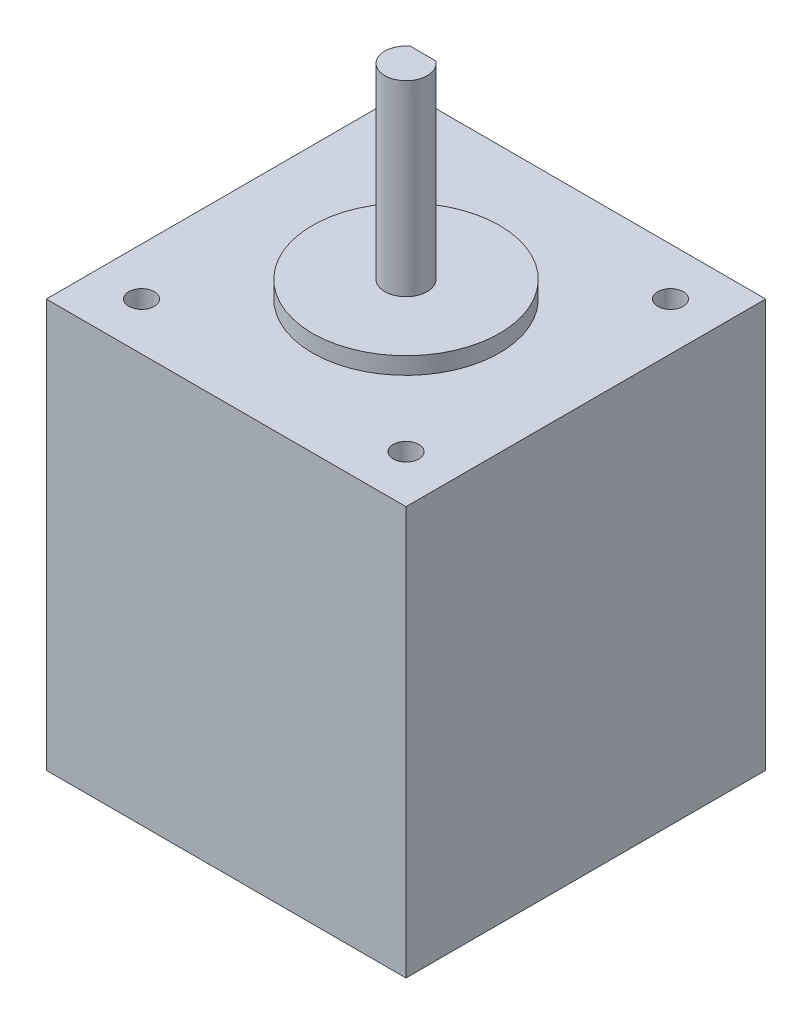
ISO-10303-21;
HEADER;
FILE_DESCRIPTION(('STEP AP214'),'2;1');
FILE_NAME('part.step','',(''),(''),'','','');
FILE_SCHEMA(('AUTOMOTIVE_DESIGN { 1 0 10303 214 1 1 1 1 }'));
ENDSEC;
DATA;
#1=APPLICATION_CONTEXT('core data for automotive mechanical design processes');
#2=APPLICATION_PROTOCOL_DEFINITION('international standard','automotive_design',2000,#1);
#3=PRODUCT_CONTEXT('',#1,'mechanical');
#4=PRODUCT('Part','Part','',(#3));
#5=PRODUCT_RELATED_PRODUCT_CATEGORY('part','',(#4));
#6=PRODUCT_DEFINITION_FORMATION('','',#4);
#7=PRODUCT_DEFINITION_CONTEXT('part definition',#1,'design');
#8=PRODUCT_DEFINITION('design','',#6,#7);
#9=PRODUCT_DEFINITION_SHAPE('','',#8);
#10=(LENGTH_UNIT() NAMED_UNIT(*) SI_UNIT(.MILLI.,.METRE.));
#11=(NAMED_UNIT(*) PLANE_ANGLE_UNIT() SI_UNIT($,.RADIAN.));
#12=(NAMED_UNIT(*) SI_UNIT($,.STERADIAN.) SOLID_ANGLE_UNIT());
#13=UNCERTAINTY_MEASURE_WITH_UNIT(LENGTH_MEASURE(1.E-05),#10,'distance_accuracy_value','');
#14=(GEOMETRIC_REPRESENTATION_CONTEXT(3) GLOBAL_UNCERTAINTY_ASSIGNED_CONTEXT((#13)) GLOBAL_UNIT_ASSIGNED_CONTEXT((#10,
#11,#12)) REPRESENTATION_CONTEXT('',''));
#15=CARTESIAN_POINT('',(0.,0.,0.));
#16=DIRECTION('',(0.,0.,1.));
#17=DIRECTION('',(1.,0.,0.));
#18=AXIS2_PLACEMENT_3D('',#15,#16,#17);
#19=CARTESIAN_POINT('',(21.15,-23.,64.6));
#20=DIRECTION('',(-1.,0.,0.));
#21=DIRECTION('',(0.,0.,1.));
#22=AXIS2_PLACEMENT_3D('',#19,#20,#21);
#23=PLANE('',#22);
#24=DIRECTION('',(0.,0.,1.));
#25=VECTOR('',#24,1.);
#26=CARTESIAN_POINT('',(21.15,25.,64.6));
#27=LINE('',#26,#25);
#28=CARTESIAN_POINT('',(21.15,25.,22.3));
#29=VERTEX_POINT('',#28);
#30=CARTESIAN_POINT('',(21.15,25.,64.6));
#31=VERTEX_POINT('',#30);
#32=EDGE_CURVE('E118',#29,#31,#27,.T.);
#33=ORIENTED_EDGE('',*,*,#32,.T.);
#34=DIRECTION('',(0.,1.,0.));
#35=VECTOR('',#34,1.);
#36=CARTESIAN_POINT('',(21.15,-23.,64.6));
#37=LINE('',#36,#35);
#38=CARTESIAN_POINT('',(21.15,-23.,64.6));
#39=VERTEX_POINT('',#38);
#40=EDGE_CURVE('E127',#39,#31,#37,.T.);
#41=ORIENTED_EDGE('',*,*,#40,.F.);
#42=DIRECTION('',(0.,0.,1.));
#43=VECTOR('',#42,1.);
#44=CARTESIAN_POINT('',(21.15,-23.,64.6));
#45=LINE('',#44,#43);
#46=CARTESIAN_POINT('',(21.15,-23.,22.3));
#47=VERTEX_POINT('',#46);
#48=EDGE_CURVE('E128',#47,#39,#45,.T.);
#49=ORIENTED_EDGE('',*,*,#48,.F.);
#50=DIRECTION('',(0.,1.,0.));
#51=VECTOR('',#50,1.);
#52=CARTESIAN_POINT('',(21.15,-23.,22.3));
#53=LINE('',#52,#51);
#54=EDGE_CURVE('E134',#47,#29,#53,.T.);
#55=ORIENTED_EDGE('',*,*,#54,.T.);
#56=EDGE_LOOP('',(#33,#41,#49,#55));
#57=FACE_BOUND('',#56,.T.);
#58=ADVANCED_FACE('F40',(#57),#23,.F.);
#59=CARTESIAN_POINT('',(-21.15,-23.,64.6));
#60=DIRECTION('',(0.,0.,-1.));
#61=DIRECTION('',(-1.,0.,0.));
#62=AXIS2_PLACEMENT_3D('',#59,#60,#61);
#63=PLANE('',#62);
#64=DIRECTION('',(-1.,0.,0.));
#65=VECTOR('',#64,1.);
#66=CARTESIAN_POINT('',(-21.15,25.,64.6));
#67=LINE('',#66,#65);
#68=CARTESIAN_POINT('',(-21.15,25.,64.6));
#69=VERTEX_POINT('',#68);
#70=EDGE_CURVE('E137',#31,#69,#67,.T.);
#71=ORIENTED_EDGE('',*,*,#70,.T.);
#72=DIRECTION('',(0.,1.,0.));
#73=VECTOR('',#72,1.);
#74=CARTESIAN_POINT('',(-21.15,-23.,64.6));
#75=LINE('',#74,#73);
#76=CARTESIAN_POINT('',(-21.15,-23.,64.6));
#77=VERTEX_POINT('',#76);
#78=EDGE_CURVE('E145',#77,#69,#75,.T.);
#79=ORIENTED_EDGE('',*,*,#78,.F.);
#80=DIRECTION('',(-1.,0.,0.));
#81=VECTOR('',#80,1.);
#82=CARTESIAN_POINT('',(-21.15,-23.,64.6));
#83=LINE('',#82,#81);
#84=EDGE_CURVE('E92',#39,#77,#83,.T.);
#85=ORIENTED_EDGE('',*,*,#84,.F.);
#86=ORIENTED_EDGE('',*,*,#40,.T.);
#87=EDGE_LOOP('',(#71,#79,#85,#86));
#88=FACE_BOUND('',#87,.T.);
#89=ADVANCED_FACE('F149',(#88),#63,.F.);
#90=CARTESIAN_POINT('',(-21.15,-23.,64.6));
#91=DIRECTION('',(1.,0.,0.));
#92=DIRECTION('',(0.,0.,-1.));
#93=AXIS2_PLACEMENT_3D('',#90,#91,#92);
#94=PLANE('',#93);
#95=DIRECTION('',(0.,0.,-1.));
#96=VECTOR('',#95,1.);
#97=CARTESIAN_POINT('',(-21.15,25.,64.6));
#98=LINE('',#97,#96);
#99=CARTESIAN_POINT('',(-21.15,25.,22.3));
#100=VERTEX_POINT('',#99);
#101=EDGE_CURVE('E139',#69,#100,#98,.T.);
#102=ORIENTED_EDGE('',*,*,#101,.T.);
#103=DIRECTION('',(0.,1.,0.));
#104=VECTOR('',#103,1.);
#105=CARTESIAN_POINT('',(-21.15,-23.,22.3));
#106=LINE('',#105,#104);
#107=CARTESIAN_POINT('',(-21.15,-23.,22.3));
#108=VERTEX_POINT('',#107);
#109=EDGE_CURVE('E143',#108,#100,#106,.T.);
#110=ORIENTED_EDGE('',*,*,#109,.F.);
#111=DIRECTION('',(0.,0.,-1.));
#112=VECTOR('',#111,1.);
#113=CARTESIAN_POINT('',(-21.15,-23.,64.6));
#114=LINE('',#113,#112);
#115=EDGE_CURVE('E131',#77,#108,#114,.T.);
#116=ORIENTED_EDGE('',*,*,#115,.F.);
#117=ORIENTED_EDGE('',*,*,#78,.T.);
#118=EDGE_LOOP('',(#102,#110,#116,#117));
#119=FACE_BOUND('',#118,.T.);
#120=ADVANCED_FACE('F158',(#119),#94,.F.);
#121=CARTESIAN_POINT('',(-21.15,-23.,22.3));
#122=DIRECTION('',(0.,0.,1.));
#123=DIRECTION('',(1.,0.,0.));
#124=AXIS2_PLACEMENT_3D('',#121,#122,#123);
#125=PLANE('',#124);
#126=DIRECTION('',(1.,0.,0.));
#127=VECTOR('',#126,1.);
#128=CARTESIAN_POINT('',(-21.15,25.,22.3));
#129=LINE('',#128,#127);
#130=EDGE_CURVE('E84',#100,#29,#129,.T.);
#131=ORIENTED_EDGE('',*,*,#130,.T.);
#132=ORIENTED_EDGE('',*,*,#54,.F.);
#133=DIRECTION('',(1.,0.,0.));
#134=VECTOR('',#133,1.);
#135=CARTESIAN_POINT('',(-21.15,-23.,22.3));
#136=LINE('',#135,#134);
#137=EDGE_CURVE('E63',#108,#47,#136,.T.);
#138=ORIENTED_EDGE('',*,*,#137,.F.);
#139=ORIENTED_EDGE('',*,*,#109,.T.);
#140=EDGE_LOOP('',(#131,#132,#138,#139));
#141=FACE_BOUND('',#140,.T.);
#142=ADVANCED_FACE('F160',(#141),#125,.F.);
#143=CARTESIAN_POINT('',(0.,-23.,0.));
#144=DIRECTION('',(0.,-1.,0.));
#145=DIRECTION('',(0.,0.,-1.));
#146=AXIS2_PLACEMENT_3D('',#143,#144,#145);
#147=PLANE('',#146);
#148=ORIENTED_EDGE('',*,*,#48,.T.);
#149=ORIENTED_EDGE('',*,*,#84,.T.);
#150=ORIENTED_EDGE('',*,*,#115,.T.);
#151=ORIENTED_EDGE('',*,*,#137,.T.);
#152=EDGE_LOOP('',(#148,#149,#150,#151));
#153=FACE_BOUND('',#152,.T.);
#154=ADVANCED_FACE('F161',(#153),#147,.T.);
#155=CARTESIAN_POINT('',(0.,25.,0.));
#156=DIRECTION('',(0.,-1.,0.));
#157=DIRECTION('',(0.,0.,-1.));
#158=AXIS2_PLACEMENT_3D('',#155,#156,#157);
#159=PLANE('',#158);
#160=CARTESIAN_POINT('',(15.55,25.,27.9));
#161=DIRECTION('',(0.,-1.,0.));
#162=DIRECTION('',(0.,0.,1.));
#163=AXIS2_PLACEMENT_3D('',#160,#161,#162);
#164=CIRCLE('',#163,1.5);
#165=CARTESIAN_POINT('',(15.55,25.,29.4));
#166=VERTEX_POINT('',#165);
#167=EDGE_CURVE('E387',#166,#166,#164,.T.);
#168=ORIENTED_EDGE('',*,*,#167,.T.);
#169=EDGE_LOOP('',(#168));
#170=FACE_BOUND('',#169,.T.);
#171=CARTESIAN_POINT('',(15.55,25.,59.));
#172=DIRECTION('',(0.,-1.,0.));
#173=DIRECTION('',(0.,0.,1.));
#174=AXIS2_PLACEMENT_3D('',#171,#172,#173);
#175=CIRCLE('',#174,1.5);
#176=CARTESIAN_POINT('',(15.55,25.,60.5));
#177=VERTEX_POINT('',#176);
#178=EDGE_CURVE('E398',#177,#177,#175,.T.);
#179=ORIENTED_EDGE('',*,*,#178,.T.);
#180=EDGE_LOOP('',(#179));
#181=FACE_BOUND('',#180,.T.);
#182=CARTESIAN_POINT('',(-15.55,25.,27.9));
#183=DIRECTION('',(0.,1.,0.));
#184=DIRECTION('',(0.,0.,1.));
#185=AXIS2_PLACEMENT_3D('',#182,#183,#184);
#186=CIRCLE('',#185,1.5);
#187=CARTESIAN_POINT('',(-15.55,25.,29.4));
#188=VERTEX_POINT('',#187);
#189=EDGE_CURVE('E404',#188,#188,#186,.T.);
#190=ORIENTED_EDGE('',*,*,#189,.F.);
#191=EDGE_LOOP('',(#190));
#192=FACE_BOUND('',#191,.T.);
#193=CARTESIAN_POINT('',(-15.55,25.,59.));
#194=DIRECTION('',(0.,1.,0.));
#195=DIRECTION('',(0.,0.,1.));
#196=AXIS2_PLACEMENT_3D('',#193,#194,#195);
#197=CIRCLE('',#196,1.5);
#198=CARTESIAN_POINT('',(-15.55,25.,60.5));
#199=VERTEX_POINT('',#198);
#200=EDGE_CURVE('E390',#199,#199,#197,.T.);
#201=ORIENTED_EDGE('',*,*,#200,.F.);
#202=EDGE_LOOP('',(#201));
#203=FACE_BOUND('',#202,.T.);
#204=CARTESIAN_POINT('',(0.,25.,43.45));
#205=DIRECTION('',(0.,1.,0.));
#206=DIRECTION('',(0.,0.,1.));
#207=AXIS2_PLACEMENT_3D('',#204,#205,#206);
#208=CIRCLE('',#207,11.);
#209=CARTESIAN_POINT('',(0.,25.,54.45));
#210=VERTEX_POINT('',#209);
#211=EDGE_CURVE('E123',#210,#210,#208,.T.);
#212=ORIENTED_EDGE('',*,*,#211,.F.);
#213=EDGE_LOOP('',(#212));
#214=FACE_BOUND('',#213,.T.);
#215=ORIENTED_EDGE('',*,*,#32,.F.);
#216=ORIENTED_EDGE('',*,*,#130,.F.);
#217=ORIENTED_EDGE('',*,*,#101,.F.);
#218=ORIENTED_EDGE('',*,*,#70,.F.);
#219=EDGE_LOOP('',(#215,#216,#217,#218));
#220=FACE_BOUND('',#219,.T.);
#221=ADVANCED_FACE('F154',(#170,#181,#192,#203,#214,#220),#159,.F.);
#222=CARTESIAN_POINT('',(0.,27.,43.45));
#223=DIRECTION('',(0.,-1.,0.));
#224=DIRECTION('',(0.,0.,-1.));
#225=AXIS2_PLACEMENT_3D('',#222,#223,#224);
#226=CYLINDRICAL_SURFACE('',#225,11.);
#227=CARTESIAN_POINT('',(0.,27.,43.45));
#228=DIRECTION('',(0.,1.,0.));
#229=DIRECTION('',(0.,0.,1.));
#230=AXIS2_PLACEMENT_3D('',#227,#228,#229);
#231=CIRCLE('',#230,11.);
#232=CARTESIAN_POINT('',(0.,27.,54.45));
#233=VERTEX_POINT('',#232);
#234=EDGE_CURVE('E115',#233,#233,#231,.T.);
#235=ORIENTED_EDGE('',*,*,#234,.F.);
#236=EDGE_LOOP('',(#235));
#237=FACE_BOUND('',#236,.T.);
#238=ORIENTED_EDGE('',*,*,#211,.T.);
#239=EDGE_LOOP('',(#238));
#240=FACE_BOUND('',#239,.T.);
#241=ADVANCED_FACE('F168',(#237,#240),#226,.T.);
#242=CARTESIAN_POINT('',(0.,27.,43.45));
#243=DIRECTION('',(0.,1.,0.));
#244=DIRECTION('',(0.,0.,1.));
#245=AXIS2_PLACEMENT_3D('',#242,#243,#244);
#246=PLANE('',#245);
#247=CARTESIAN_POINT('',(0.,27.,43.45));
#248=DIRECTION('',(0.,1.,0.));
#249=DIRECTION('',(0.,0.,1.));
#250=AXIS2_PLACEMENT_3D('',#247,#248,#249);
#251=CIRCLE('',#250,2.5);
#252=CARTESIAN_POINT('',(0.,27.,45.95));
#253=VERTEX_POINT('',#252);
#254=EDGE_CURVE('E107',#253,#253,#251,.T.);
#255=ORIENTED_EDGE('',*,*,#254,.F.);
#256=EDGE_LOOP('',(#255));
#257=FACE_BOUND('',#256,.T.);
#258=ORIENTED_EDGE('',*,*,#234,.T.);
#259=EDGE_LOOP('',(#258));
#260=FACE_BOUND('',#259,.T.);
#261=ADVANCED_FACE('F203',(#257,#260),#246,.T.);
#262=CARTESIAN_POINT('',(0.,49.,43.45));
#263=DIRECTION('',(0.,-1.,0.));
#264=DIRECTION('',(0.,0.,-1.));
#265=AXIS2_PLACEMENT_3D('',#262,#263,#264);
#266=CYLINDRICAL_SURFACE('',#265,2.5);
#267=CARTESIAN_POINT('',(0.,49.,43.45));
#268=DIRECTION('',(0.,1.,0.));
#269=DIRECTION('',(0.,0.,1.));
#270=AXIS2_PLACEMENT_3D('',#267,#268,#269);
#271=CIRCLE('',#270,2.5);
#272=CARTESIAN_POINT('',(-1.5,49.,41.45));
#273=VERTEX_POINT('',#272);
#274=CARTESIAN_POINT('',(1.5,49.,41.45));
#275=VERTEX_POINT('',#274);
#276=EDGE_CURVE('E111',#273,#275,#271,.T.);
#277=ORIENTED_EDGE('',*,*,#276,.F.);
#278=DIRECTION('',(0.,-1.,0.));
#279=VECTOR('',#278,1.);
#280=CARTESIAN_POINT('',(-1.5,49.,41.45));
#281=LINE('',#280,#279);
#282=CARTESIAN_POINT('',(-1.5,34.,41.45));
#283=VERTEX_POINT('',#282);
#284=EDGE_CURVE('E54',#273,#283,#281,.T.);
#285=ORIENTED_EDGE('',*,*,#284,.T.);
#286=CARTESIAN_POINT('',(0.,34.,43.45));
#287=DIRECTION('',(0.,1.,0.));
#288=DIRECTION('',(0.,0.,1.));
#289=AXIS2_PLACEMENT_3D('',#286,#287,#288);
#290=CIRCLE('',#289,2.5);
#291=CARTESIAN_POINT('',(1.5,34.,41.45));
#292=VERTEX_POINT('',#291);
#293=EDGE_CURVE('E11',#292,#283,#290,.T.);
#294=ORIENTED_EDGE('',*,*,#293,.F.);
#295=DIRECTION('',(0.,-1.,0.));
#296=VECTOR('',#295,1.);
#297=CARTESIAN_POINT('',(1.5,49.,41.45));
#298=LINE('',#297,#296);
#299=EDGE_CURVE('E102',#292,#275,#298,.F.);
#300=ORIENTED_EDGE('',*,*,#299,.T.);
#301=EDGE_LOOP('',(#277,#285,#294,#300));
#302=FACE_BOUND('',#301,.T.);
#303=ORIENTED_EDGE('',*,*,#254,.T.);
#304=EDGE_LOOP('',(#303));
#305=FACE_BOUND('',#304,.T.);
#306=ADVANCED_FACE('F109',(#302,#305),#266,.T.);
#307=CARTESIAN_POINT('',(0.,49.,43.45));
#308=DIRECTION('',(0.,1.,0.));
#309=DIRECTION('',(0.,0.,1.));
#310=AXIS2_PLACEMENT_3D('',#307,#308,#309);
#311=PLANE('',#310);
#312=DIRECTION('',(1.,0.,0.));
#313=VECTOR('',#312,1.);
#314=CARTESIAN_POINT('',(0.,49.,41.45));
#315=LINE('',#314,#313);
#316=EDGE_CURVE('E47',#273,#275,#315,.T.);
#317=ORIENTED_EDGE('',*,*,#316,.F.);
#318=ORIENTED_EDGE('',*,*,#276,.T.);
#319=EDGE_LOOP('',(#317,#318));
#320=FACE_BOUND('',#319,.T.);
#321=ADVANCED_FACE('F114',(#320),#311,.T.);
#322=CARTESIAN_POINT('',(0.,34.,0.));
#323=DIRECTION('',(0.,1.,0.));
#324=DIRECTION('',(0.,0.,1.));
#325=AXIS2_PLACEMENT_3D('',#322,#323,#324);
#326=PLANE('',#325);
#327=DIRECTION('',(1.,0.,0.));
#328=VECTOR('',#327,1.);
#329=CARTESIAN_POINT('',(-2.5,34.,41.45));
#330=LINE('',#329,#328);
#331=EDGE_CURVE('E112',#283,#292,#330,.T.);
#332=ORIENTED_EDGE('',*,*,#331,.T.);
#333=ORIENTED_EDGE('',*,*,#293,.T.);
#334=EDGE_LOOP('',(#332,#333));
#335=FACE_BOUND('',#334,.T.);
#336=ADVANCED_FACE('F232',(#335),#326,.T.);
#337=CARTESIAN_POINT('',(-2.5,34.,41.45));
#338=DIRECTION('',(0.,0.,1.));
#339=DIRECTION('',(1.,0.,0.));
#340=AXIS2_PLACEMENT_3D('',#337,#338,#339);
#341=PLANE('',#340);
#342=ORIENTED_EDGE('',*,*,#316,.T.);
#343=ORIENTED_EDGE('',*,*,#299,.F.);
#344=ORIENTED_EDGE('',*,*,#331,.F.);
#345=ORIENTED_EDGE('',*,*,#284,.F.);
#346=EDGE_LOOP('',(#342,#343,#344,#345));
#347=FACE_BOUND('',#346,.T.);
#348=ADVANCED_FACE('F101',(#347),#341,.F.);
#349=CARTESIAN_POINT('',(-15.55,20.5,59.));
#350=DIRECTION('',(0.,1.,0.));
#351=DIRECTION('',(0.,0.,1.));
#352=AXIS2_PLACEMENT_3D('',#349,#350,#351);
#353=CYLINDRICAL_SURFACE('',#352,1.5);
#354=CARTESIAN_POINT('',(-15.55,20.5,59.));
#355=DIRECTION('',(0.,1.,0.));
#356=DIRECTION('',(0.,0.,1.));
#357=AXIS2_PLACEMENT_3D('',#354,#355,#356);
#358=CIRCLE('',#357,1.5);
#359=CARTESIAN_POINT('',(-15.55,20.5,60.5));
#360=VERTEX_POINT('',#359);
#361=EDGE_CURVE('E386',#360,#360,#358,.T.);
#362=ORIENTED_EDGE('',*,*,#361,.F.);
#363=EDGE_LOOP('',(#362));
#364=FACE_BOUND('',#363,.T.);
#365=ORIENTED_EDGE('',*,*,#200,.T.);
#366=EDGE_LOOP('',(#365));
#367=FACE_BOUND('',#366,.T.);
#368=ADVANCED_FACE('F252',(#364,#367),#353,.F.);
#369=CARTESIAN_POINT('',(-15.55,20.5,59.));
#370=DIRECTION('',(0.,1.,0.));
#371=DIRECTION('',(0.,0.,1.));
#372=AXIS2_PLACEMENT_3D('',#369,#370,#371);
#373=PLANE('',#372);
#374=ORIENTED_EDGE('',*,*,#361,.T.);
#375=EDGE_LOOP('',(#374));
#376=FACE_BOUND('',#375,.T.);
#377=ADVANCED_FACE('F262',(#376),#373,.T.);
#378=CARTESIAN_POINT('',(-15.55,20.5,27.9));
#379=DIRECTION('',(0.,1.,0.));
#380=DIRECTION('',(0.,0.,1.));
#381=AXIS2_PLACEMENT_3D('',#378,#379,#380);
#382=CYLINDRICAL_SURFACE('',#381,1.5);
#383=CARTESIAN_POINT('',(-15.55,20.5,27.9));
#384=DIRECTION('',(0.,1.,0.));
#385=DIRECTION('',(0.,0.,1.));
#386=AXIS2_PLACEMENT_3D('',#383,#384,#385);
#387=CIRCLE('',#386,1.5);
#388=CARTESIAN_POINT('',(-15.55,20.5,29.4));
#389=VERTEX_POINT('',#388);
#390=EDGE_CURVE('E401',#389,#389,#387,.T.);
#391=ORIENTED_EDGE('',*,*,#390,.F.);
#392=EDGE_LOOP('',(#391));
#393=FACE_BOUND('',#392,.T.);
#394=ORIENTED_EDGE('',*,*,#189,.T.);
#395=EDGE_LOOP('',(#394));
#396=FACE_BOUND('',#395,.T.);
#397=ADVANCED_FACE('F273',(#393,#396),#382,.F.);
#398=CARTESIAN_POINT('',(-15.55,20.5,27.9));
#399=DIRECTION('',(0.,1.,0.));
#400=DIRECTION('',(0.,0.,1.));
#401=AXIS2_PLACEMENT_3D('',#398,#399,#400);
#402=PLANE('',#401);
#403=ORIENTED_EDGE('',*,*,#390,.T.);
#404=EDGE_LOOP('',(#403));
#405=FACE_BOUND('',#404,.T.);
#406=ADVANCED_FACE('F284',(#405),#402,.T.);
#407=CARTESIAN_POINT('',(15.55,20.5,59.));
#408=DIRECTION('',(0.,1.,0.));
#409=DIRECTION('',(0.,0.,1.));
#410=AXIS2_PLACEMENT_3D('',#407,#408,#409);
#411=CYLINDRICAL_SURFACE('',#410,1.5);
#412=CARTESIAN_POINT('',(15.55,20.5,59.));
#413=DIRECTION('',(0.,-1.,0.));
#414=DIRECTION('',(0.,0.,1.));
#415=AXIS2_PLACEMENT_3D('',#412,#413,#414);
#416=CIRCLE('',#415,1.5);
#417=CARTESIAN_POINT('',(15.55,20.5,60.5));
#418=VERTEX_POINT('',#417);
#419=EDGE_CURVE('E393',#418,#418,#416,.T.);
#420=ORIENTED_EDGE('',*,*,#419,.T.);
#421=EDGE_LOOP('',(#420));
#422=FACE_BOUND('',#421,.T.);
#423=ORIENTED_EDGE('',*,*,#178,.F.);
#424=EDGE_LOOP('',(#423));
#425=FACE_BOUND('',#424,.T.);
#426=ADVANCED_FACE('F295',(#422,#425),#411,.F.);
#427=CARTESIAN_POINT('',(15.55,20.5,59.));
#428=DIRECTION('',(0.,1.,0.));
#429=DIRECTION('',(0.,0.,1.));
#430=AXIS2_PLACEMENT_3D('',#427,#428,#429);
#431=PLANE('',#430);
#432=ORIENTED_EDGE('',*,*,#419,.F.);
#433=EDGE_LOOP('',(#432));
#434=FACE_BOUND('',#433,.T.);
#435=ADVANCED_FACE('F312',(#434),#431,.T.);
#436=CARTESIAN_POINT('',(15.55,20.5,27.9));
#437=DIRECTION('',(0.,1.,0.));
#438=DIRECTION('',(0.,0.,1.));
#439=AXIS2_PLACEMENT_3D('',#436,#437,#438);
#440=CYLINDRICAL_SURFACE('',#439,1.5);
#441=CARTESIAN_POINT('',(15.55,20.5,27.9));
#442=DIRECTION('',(0.,-1.,0.));
#443=DIRECTION('',(0.,0.,1.));
#444=AXIS2_PLACEMENT_3D('',#441,#442,#443);
#445=CIRCLE('',#444,1.5);
#446=CARTESIAN_POINT('',(15.55,20.5,29.4));
#447=VERTEX_POINT('',#446);
#448=EDGE_CURVE('E385',#447,#447,#445,.T.);
#449=ORIENTED_EDGE('',*,*,#448,.T.);
#450=EDGE_LOOP('',(#449));
#451=FACE_BOUND('',#450,.T.);
#452=ORIENTED_EDGE('',*,*,#167,.F.);
#453=EDGE_LOOP('',(#452));
#454=FACE_BOUND('',#453,.T.);
#455=ADVANCED_FACE('F323',(#451,#454),#440,.F.);
#456=CARTESIAN_POINT('',(15.55,20.5,27.9));
#457=DIRECTION('',(0.,1.,0.));
#458=DIRECTION('',(0.,0.,1.));
#459=AXIS2_PLACEMENT_3D('',#456,#457,#458);
#460=PLANE('',#459);
#461=ORIENTED_EDGE('',*,*,#448,.F.);
#462=EDGE_LOOP('',(#461));
#463=FACE_BOUND('',#462,.T.);
#464=ADVANCED_FACE('F334',(#463),#460,.T.);
#465=CLOSED_SHELL('',(#58,#89,#120,#142,#154,#221,#241,#261,#306,#321,#336,#348,#368,#377,#397,
#406,#426,#435,#455,#464));
#466=MANIFOLD_SOLID_BREP('B2',#465);
#467=ADVANCED_BREP_SHAPE_REPRESENTATION('',(#18,#466),#14);
#468=SHAPE_DEFINITION_REPRESENTATION(#9,#467);
ENDSEC;
END-ISO-10303-21;
